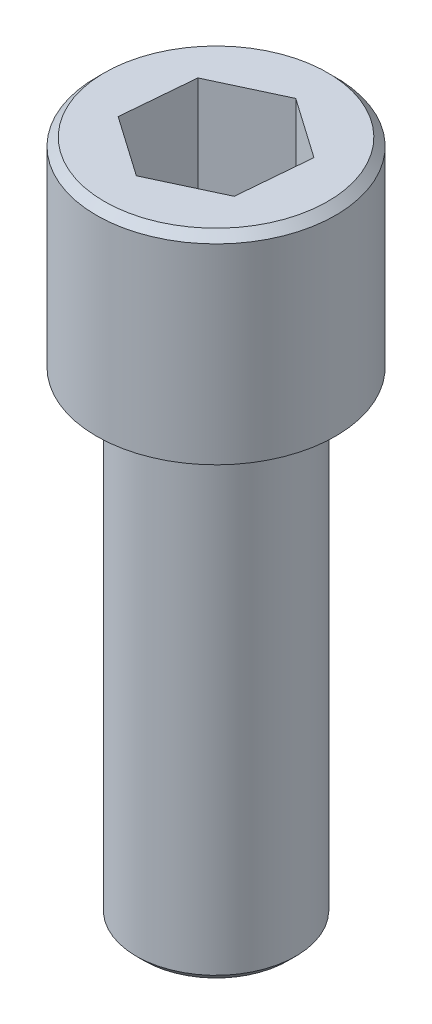
ISO-10303-21;
HEADER;
FILE_DESCRIPTION(('STEP AP214'),'2;1');
FILE_NAME('part.step','',(''),(''),'','','');
FILE_SCHEMA(('AUTOMOTIVE_DESIGN { 1 0 10303 214 1 1 1 1 }'));
ENDSEC;
DATA;
#1=APPLICATION_CONTEXT('core data for automotive mechanical design processes');
#2=APPLICATION_PROTOCOL_DEFINITION('international standard','automotive_design',2000,#1);
#3=PRODUCT_CONTEXT('',#1,'mechanical');
#4=PRODUCT('Part','Part','',(#3));
#5=PRODUCT_RELATED_PRODUCT_CATEGORY('part','',(#4));
#6=PRODUCT_DEFINITION_FORMATION('','',#4);
#7=PRODUCT_DEFINITION_CONTEXT('part definition',#1,'design');
#8=PRODUCT_DEFINITION('design','',#6,#7);
#9=PRODUCT_DEFINITION_SHAPE('','',#8);
#10=(LENGTH_UNIT() NAMED_UNIT(*) SI_UNIT(.MILLI.,.METRE.));
#11=(NAMED_UNIT(*) PLANE_ANGLE_UNIT() SI_UNIT($,.RADIAN.));
#12=(NAMED_UNIT(*) SI_UNIT($,.STERADIAN.) SOLID_ANGLE_UNIT());
#13=UNCERTAINTY_MEASURE_WITH_UNIT(LENGTH_MEASURE(1.E-05),#10,'distance_accuracy_value','');
#14=(GEOMETRIC_REPRESENTATION_CONTEXT(3) GLOBAL_UNCERTAINTY_ASSIGNED_CONTEXT((#13)) GLOBAL_UNIT_ASSIGNED_CONTEXT((#10,
#11,#12)) REPRESENTATION_CONTEXT('',''));
#15=CARTESIAN_POINT('',(0.,0.,0.));
#16=DIRECTION('',(0.,0.,1.));
#17=DIRECTION('',(1.,0.,0.));
#18=AXIS2_PLACEMENT_3D('',#15,#16,#17);
#19=CARTESIAN_POINT('',(0.,15.,0.));
#20=DIRECTION('',(0.,-1.,0.));
#21=DIRECTION('',(0.,0.,-1.));
#22=AXIS2_PLACEMENT_3D('',#19,#20,#21);
#23=CYLINDRICAL_SURFACE('',#22,2.5);
#24=CARTESIAN_POINT('',(0.,0.25,0.));
#25=DIRECTION('',(0.,1.,0.));
#26=DIRECTION('',(0.,0.,1.));
#27=AXIS2_PLACEMENT_3D('',#24,#25,#26);
#28=CIRCLE('',#27,2.5);
#29=CARTESIAN_POINT('',(0.,0.25,2.5));
#30=VERTEX_POINT('',#29);
#31=EDGE_CURVE('E146',#30,#30,#28,.T.);
#32=ORIENTED_EDGE('',*,*,#31,.T.);
#33=EDGE_LOOP('',(#32));
#34=FACE_BOUND('',#33,.T.);
#35=CARTESIAN_POINT('',(0.,15.,0.));
#36=DIRECTION('',(0.,1.,0.));
#37=DIRECTION('',(0.,0.,1.));
#38=AXIS2_PLACEMENT_3D('',#35,#36,#37);
#39=CIRCLE('',#38,2.5);
#40=CARTESIAN_POINT('',(0.,15.,2.5));
#41=VERTEX_POINT('',#40);
#42=EDGE_CURVE('E143',#41,#41,#39,.T.);
#43=ORIENTED_EDGE('',*,*,#42,.F.);
#44=EDGE_LOOP('',(#43));
#45=FACE_BOUND('',#44,.T.);
#46=ADVANCED_FACE('F33',(#34,#45),#23,.T.);
#47=CARTESIAN_POINT('',(0.,0.,0.));
#48=DIRECTION('',(0.,1.,0.));
#49=DIRECTION('',(0.,0.,1.));
#50=AXIS2_PLACEMENT_3D('',#47,#48,#49);
#51=PLANE('',#50);
#52=CARTESIAN_POINT('',(0.,0.,0.));
#53=DIRECTION('',(0.,1.,0.));
#54=DIRECTION('',(0.,0.,1.));
#55=AXIS2_PLACEMENT_3D('',#52,#53,#54);
#56=CIRCLE('',#55,2.25);
#57=CARTESIAN_POINT('',(0.,0.,2.25));
#58=VERTEX_POINT('',#57);
#59=EDGE_CURVE('E149',#58,#58,#56,.F.);
#60=ORIENTED_EDGE('',*,*,#59,.T.);
#61=EDGE_LOOP('',(#60));
#62=FACE_BOUND('',#61,.T.);
#63=ADVANCED_FACE('F166',(#62),#51,.F.);
#64=CARTESIAN_POINT('',(0.,21.25,0.));
#65=DIRECTION('',(0.,-1.,0.));
#66=DIRECTION('',(0.,0.,-1.));
#67=AXIS2_PLACEMENT_3D('',#64,#65,#66);
#68=CYLINDRICAL_SURFACE('',#67,3.75);
#69=CARTESIAN_POINT('',(0.,21.,0.));
#70=DIRECTION('',(0.,1.,0.));
#71=DIRECTION('',(0.,0.,1.));
#72=AXIS2_PLACEMENT_3D('',#69,#70,#71);
#73=CIRCLE('',#72,3.75);
#74=CARTESIAN_POINT('',(0.,21.,3.75));
#75=VERTEX_POINT('',#74);
#76=EDGE_CURVE('E11',#75,#75,#73,.F.);
#77=ORIENTED_EDGE('',*,*,#76,.T.);
#78=EDGE_LOOP('',(#77));
#79=FACE_BOUND('',#78,.T.);
#80=CARTESIAN_POINT('',(0.,15.,0.));
#81=DIRECTION('',(0.,1.,0.));
#82=DIRECTION('',(0.,0.,1.));
#83=AXIS2_PLACEMENT_3D('',#80,#81,#82);
#84=CIRCLE('',#83,3.75);
#85=CARTESIAN_POINT('',(0.,15.,3.75));
#86=VERTEX_POINT('',#85);
#87=EDGE_CURVE('E135',#86,#86,#84,.T.);
#88=ORIENTED_EDGE('',*,*,#87,.T.);
#89=EDGE_LOOP('',(#88));
#90=FACE_BOUND('',#89,.T.);
#91=ADVANCED_FACE('F172',(#79,#90),#68,.T.);
#92=CARTESIAN_POINT('',(0.,21.25,0.));
#93=DIRECTION('',(0.,1.,0.));
#94=DIRECTION('',(0.,0.,1.));
#95=AXIS2_PLACEMENT_3D('',#92,#93,#94);
#96=PLANE('',#95);
#97=CARTESIAN_POINT('',(0.,21.25,0.));
#98=DIRECTION('',(0.,1.,0.));
#99=DIRECTION('',(0.,0.,1.));
#100=AXIS2_PLACEMENT_3D('',#97,#98,#99);
#101=CIRCLE('',#100,3.5);
#102=CARTESIAN_POINT('',(0.,21.25,3.5));
#103=VERTEX_POINT('',#102);
#104=EDGE_CURVE('E41',#103,#103,#101,.T.);
#105=ORIENTED_EDGE('',*,*,#104,.T.);
#106=EDGE_LOOP('',(#105));
#107=FACE_BOUND('',#106,.T.);
#108=DIRECTION('',(0.819694119605471,0.,0.572801492913742));
#109=VECTOR('',#108,1.);
#110=CARTESIAN_POINT('',(-2.09210422704223,21.25,0.977974046959006));
#111=LINE('',#110,#109);
#112=CARTESIAN_POINT('',(-2.09210422704223,21.25,0.977974046959006));
#113=VERTEX_POINT('',#112);
#114=CARTESIAN_POINT('',(-0.199101744612739,21.25,2.30080243146288));
#115=VERTEX_POINT('',#114);
#116=EDGE_CURVE('E48',#113,#115,#111,.T.);
#117=ORIENTED_EDGE('',*,*,#116,.F.);
#118=DIRECTION('',(-0.0862135843862166,0.,0.996276677367929));
#119=VECTOR('',#118,1.);
#120=CARTESIAN_POINT('',(-1.89300248242949,21.25,-1.32282838450387));
#121=LINE('',#120,#119);
#122=CARTESIAN_POINT('',(-1.89300248242949,21.25,-1.32282838450387));
#123=VERTEX_POINT('',#122);
#124=EDGE_CURVE('E131',#123,#113,#121,.T.);
#125=ORIENTED_EDGE('',*,*,#124,.F.);
#126=DIRECTION('',(-0.905907703991688,0.,0.423475184454187));
#127=VECTOR('',#126,1.);
#128=CARTESIAN_POINT('',(0.199101744612738,21.25,-2.30080243146288));
#129=LINE('',#128,#127);
#130=CARTESIAN_POINT('',(0.199101744612738,21.25,-2.30080243146288));
#131=VERTEX_POINT('',#130);
#132=EDGE_CURVE('E129',#131,#123,#129,.T.);
#133=ORIENTED_EDGE('',*,*,#132,.F.);
#134=DIRECTION('',(-0.819694119605471,0.,-0.572801492913742));
#135=VECTOR('',#134,1.);
#136=CARTESIAN_POINT('',(2.09210422704223,21.25,-0.977974046959006));
#137=LINE('',#136,#135);
#138=CARTESIAN_POINT('',(2.09210422704223,21.25,-0.977974046959006));
#139=VERTEX_POINT('',#138);
#140=EDGE_CURVE('E96',#139,#131,#137,.T.);
#141=ORIENTED_EDGE('',*,*,#140,.F.);
#142=DIRECTION('',(0.0862135843862168,0.,-0.996276677367929));
#143=VECTOR('',#142,1.);
#144=CARTESIAN_POINT('',(1.89300248242949,21.25,1.32282838450388));
#145=LINE('',#144,#143);
#146=CARTESIAN_POINT('',(1.89300248242949,21.25,1.32282838450388));
#147=VERTEX_POINT('',#146);
#148=EDGE_CURVE('E125',#147,#139,#145,.T.);
#149=ORIENTED_EDGE('',*,*,#148,.F.);
#150=DIRECTION('',(0.905907703991688,0.,-0.423475184454187));
#151=VECTOR('',#150,1.);
#152=CARTESIAN_POINT('',(-0.19910174461274,21.25,2.30080243146288));
#153=LINE('',#152,#151);
#154=EDGE_CURVE('E122',#115,#147,#153,.T.);
#155=ORIENTED_EDGE('',*,*,#154,.F.);
#156=EDGE_LOOP('',(#117,#125,#133,#141,#149,#155));
#157=FACE_BOUND('',#156,.T.);
#158=ADVANCED_FACE('F154',(#107,#157),#96,.T.);
#159=CARTESIAN_POINT('',(0.,15.,0.));
#160=DIRECTION('',(0.,1.,0.));
#161=DIRECTION('',(0.,0.,1.));
#162=AXIS2_PLACEMENT_3D('',#159,#160,#161);
#163=PLANE('',#162);
#164=ORIENTED_EDGE('',*,*,#42,.T.);
#165=EDGE_LOOP('',(#164));
#166=FACE_BOUND('',#165,.T.);
#167=ORIENTED_EDGE('',*,*,#87,.F.);
#168=EDGE_LOOP('',(#167));
#169=FACE_BOUND('',#168,.T.);
#170=ADVANCED_FACE('F180',(#166,#169),#163,.F.);
#171=CARTESIAN_POINT('',(-2.09210422704223,17.5,0.977974046959006));
#172=DIRECTION('',(-0.572801492913742,0.,0.819694119605471));
#173=DIRECTION('',(0.819694119605471,0.,0.572801492913742));
#174=AXIS2_PLACEMENT_3D('',#171,#172,#173);
#175=PLANE('',#174);
#176=ORIENTED_EDGE('',*,*,#116,.T.);
#177=DIRECTION('',(0.,1.,0.));
#178=VECTOR('',#177,1.);
#179=CARTESIAN_POINT('',(-0.19910174461274,17.5,2.30080243146288));
#180=LINE('',#179,#178);
#181=CARTESIAN_POINT('',(-0.19910174461274,17.5,2.30080243146288));
#182=VERTEX_POINT('',#181);
#183=EDGE_CURVE('E78',#182,#115,#180,.T.);
#184=ORIENTED_EDGE('',*,*,#183,.F.);
#185=DIRECTION('',(0.819694119605471,0.,0.572801492913742));
#186=VECTOR('',#185,1.);
#187=CARTESIAN_POINT('',(-2.09210422704223,17.5,0.977974046959006));
#188=LINE('',#187,#186);
#189=CARTESIAN_POINT('',(-2.09210422704223,17.5,0.977974046959006));
#190=VERTEX_POINT('',#189);
#191=EDGE_CURVE('E133',#190,#182,#188,.T.);
#192=ORIENTED_EDGE('',*,*,#191,.F.);
#193=DIRECTION('',(0.,1.,0.));
#194=VECTOR('',#193,1.);
#195=CARTESIAN_POINT('',(-2.09210422704223,17.5,0.977974046959006));
#196=LINE('',#195,#194);
#197=EDGE_CURVE('E56',#190,#113,#196,.T.);
#198=ORIENTED_EDGE('',*,*,#197,.T.);
#199=EDGE_LOOP('',(#176,#184,#192,#198));
#200=FACE_BOUND('',#199,.T.);
#201=ADVANCED_FACE('F183',(#200),#175,.F.);
#202=CARTESIAN_POINT('',(-1.89300248242949,17.5,-1.32282838450387));
#203=DIRECTION('',(-0.996276677367929,0.,-0.0862135843862166));
#204=DIRECTION('',(-0.0862135843862166,0.,0.996276677367929));
#205=AXIS2_PLACEMENT_3D('',#202,#203,#204);
#206=PLANE('',#205);
#207=ORIENTED_EDGE('',*,*,#124,.T.);
#208=ORIENTED_EDGE('',*,*,#197,.F.);
#209=DIRECTION('',(-0.0862135843862166,0.,0.996276677367929));
#210=VECTOR('',#209,1.);
#211=CARTESIAN_POINT('',(-1.89300248242949,17.5,-1.32282838450387));
#212=LINE('',#211,#210);
#213=CARTESIAN_POINT('',(-1.89300248242949,17.5,-1.32282838450387));
#214=VERTEX_POINT('',#213);
#215=EDGE_CURVE('E108',#214,#190,#212,.T.);
#216=ORIENTED_EDGE('',*,*,#215,.F.);
#217=DIRECTION('',(0.,1.,0.));
#218=VECTOR('',#217,1.);
#219=CARTESIAN_POINT('',(-1.89300248242949,17.5,-1.32282838450387));
#220=LINE('',#219,#218);
#221=EDGE_CURVE('E100',#214,#123,#220,.T.);
#222=ORIENTED_EDGE('',*,*,#221,.T.);
#223=EDGE_LOOP('',(#207,#208,#216,#222));
#224=FACE_BOUND('',#223,.T.);
#225=ADVANCED_FACE('F189',(#224),#206,.F.);
#226=CARTESIAN_POINT('',(0.199101744612738,17.5,-2.30080243146288));
#227=DIRECTION('',(-0.423475184454187,0.,-0.905907703991688));
#228=DIRECTION('',(-0.905907703991688,0.,0.423475184454187));
#229=AXIS2_PLACEMENT_3D('',#226,#227,#228);
#230=PLANE('',#229);
#231=ORIENTED_EDGE('',*,*,#132,.T.);
#232=ORIENTED_EDGE('',*,*,#221,.F.);
#233=DIRECTION('',(-0.905907703991688,0.,0.423475184454187));
#234=VECTOR('',#233,1.);
#235=CARTESIAN_POINT('',(0.199101744612738,17.5,-2.30080243146288));
#236=LINE('',#235,#234);
#237=CARTESIAN_POINT('',(0.199101744612738,17.5,-2.30080243146288));
#238=VERTEX_POINT('',#237);
#239=EDGE_CURVE('E104',#238,#214,#236,.T.);
#240=ORIENTED_EDGE('',*,*,#239,.F.);
#241=DIRECTION('',(0.,1.,0.));
#242=VECTOR('',#241,1.);
#243=CARTESIAN_POINT('',(0.199101744612738,17.5,-2.30080243146288));
#244=LINE('',#243,#242);
#245=EDGE_CURVE('E89',#238,#131,#244,.T.);
#246=ORIENTED_EDGE('',*,*,#245,.T.);
#247=EDGE_LOOP('',(#231,#232,#240,#246));
#248=FACE_BOUND('',#247,.T.);
#249=ADVANCED_FACE('F105',(#248),#230,.F.);
#250=CARTESIAN_POINT('',(2.09210422704223,17.5,-0.977974046959006));
#251=DIRECTION('',(0.572801492913742,0.,-0.819694119605471));
#252=DIRECTION('',(-0.819694119605471,0.,-0.572801492913742));
#253=AXIS2_PLACEMENT_3D('',#250,#251,#252);
#254=PLANE('',#253);
#255=ORIENTED_EDGE('',*,*,#140,.T.);
#256=ORIENTED_EDGE('',*,*,#245,.F.);
#257=DIRECTION('',(-0.819694119605471,0.,-0.572801492913742));
#258=VECTOR('',#257,1.);
#259=CARTESIAN_POINT('',(2.09210422704223,17.5,-0.977974046959006));
#260=LINE('',#259,#258);
#261=CARTESIAN_POINT('',(2.09210422704223,17.5,-0.977974046959006));
#262=VERTEX_POINT('',#261);
#263=EDGE_CURVE('E93',#262,#238,#260,.T.);
#264=ORIENTED_EDGE('',*,*,#263,.F.);
#265=DIRECTION('',(0.,1.,0.));
#266=VECTOR('',#265,1.);
#267=CARTESIAN_POINT('',(2.09210422704223,17.5,-0.977974046959006));
#268=LINE('',#267,#266);
#269=EDGE_CURVE('E101',#262,#139,#268,.T.);
#270=ORIENTED_EDGE('',*,*,#269,.T.);
#271=EDGE_LOOP('',(#255,#256,#264,#270));
#272=FACE_BOUND('',#271,.T.);
#273=ADVANCED_FACE('F91',(#272),#254,.F.);
#274=CARTESIAN_POINT('',(1.89300248242949,17.5,1.32282838450388));
#275=DIRECTION('',(0.996276677367929,0.,0.0862135843862169));
#276=DIRECTION('',(0.0862135843862169,0.,-0.996276677367929));
#277=AXIS2_PLACEMENT_3D('',#274,#275,#276);
#278=PLANE('',#277);
#279=ORIENTED_EDGE('',*,*,#148,.T.);
#280=ORIENTED_EDGE('',*,*,#269,.F.);
#281=DIRECTION('',(0.0862135843862168,0.,-0.996276677367929));
#282=VECTOR('',#281,1.);
#283=CARTESIAN_POINT('',(1.89300248242949,17.5,1.32282838450388));
#284=LINE('',#283,#282);
#285=CARTESIAN_POINT('',(1.89300248242949,17.5,1.32282838450388));
#286=VERTEX_POINT('',#285);
#287=EDGE_CURVE('E114',#286,#262,#284,.T.);
#288=ORIENTED_EDGE('',*,*,#287,.F.);
#289=DIRECTION('',(0.,1.,0.));
#290=VECTOR('',#289,1.);
#291=CARTESIAN_POINT('',(1.89300248242949,17.5,1.32282838450388));
#292=LINE('',#291,#290);
#293=EDGE_CURVE('E138',#286,#147,#292,.T.);
#294=ORIENTED_EDGE('',*,*,#293,.T.);
#295=EDGE_LOOP('',(#279,#280,#288,#294));
#296=FACE_BOUND('',#295,.T.);
#297=ADVANCED_FACE('F193',(#296),#278,.F.);
#298=CARTESIAN_POINT('',(-0.19910174461274,17.5,2.30080243146288));
#299=DIRECTION('',(0.423475184454187,0.,0.905907703991688));
#300=DIRECTION('',(0.905907703991688,0.,-0.423475184454187));
#301=AXIS2_PLACEMENT_3D('',#298,#299,#300);
#302=PLANE('',#301);
#303=ORIENTED_EDGE('',*,*,#154,.T.);
#304=ORIENTED_EDGE('',*,*,#293,.F.);
#305=DIRECTION('',(0.905907703991688,0.,-0.423475184454187));
#306=VECTOR('',#305,1.);
#307=CARTESIAN_POINT('',(-0.19910174461274,17.5,2.30080243146288));
#308=LINE('',#307,#306);
#309=EDGE_CURVE('E116',#182,#286,#308,.T.);
#310=ORIENTED_EDGE('',*,*,#309,.F.);
#311=ORIENTED_EDGE('',*,*,#183,.T.);
#312=EDGE_LOOP('',(#303,#304,#310,#311));
#313=FACE_BOUND('',#312,.T.);
#314=ADVANCED_FACE('F190',(#313),#302,.F.);
#315=CARTESIAN_POINT('',(0.,17.5,0.));
#316=DIRECTION('',(0.,1.,0.));
#317=DIRECTION('',(0.,0.,1.));
#318=AXIS2_PLACEMENT_3D('',#315,#316,#317);
#319=PLANE('',#318);
#320=ORIENTED_EDGE('',*,*,#191,.T.);
#321=ORIENTED_EDGE('',*,*,#309,.T.);
#322=ORIENTED_EDGE('',*,*,#287,.T.);
#323=ORIENTED_EDGE('',*,*,#263,.T.);
#324=ORIENTED_EDGE('',*,*,#239,.T.);
#325=ORIENTED_EDGE('',*,*,#215,.T.);
#326=EDGE_LOOP('',(#320,#321,#322,#323,#324,#325));
#327=FACE_BOUND('',#326,.T.);
#328=ADVANCED_FACE('F111',(#327),#319,.T.);
#329=CARTESIAN_POINT('',(0.,0.25,0.));
#330=DIRECTION('',(0.,1.,0.));
#331=DIRECTION('',(0.,0.,1.));
#332=AXIS2_PLACEMENT_3D('',#329,#330,#331);
#333=CONICAL_SURFACE('',#332,2.5,0.785398163397454);
#334=ORIENTED_EDGE('',*,*,#59,.F.);
#335=EDGE_LOOP('',(#334));
#336=FACE_BOUND('',#335,.T.);
#337=ORIENTED_EDGE('',*,*,#31,.F.);
#338=EDGE_LOOP('',(#337));
#339=FACE_BOUND('',#338,.T.);
#340=ADVANCED_FACE('F158',(#336,#339),#333,.T.);
#341=CARTESIAN_POINT('',(0.,21.25,0.));
#342=DIRECTION('',(0.,-1.,0.));
#343=DIRECTION('',(0.,0.,-1.));
#344=AXIS2_PLACEMENT_3D('',#341,#342,#343);
#345=CONICAL_SURFACE('',#344,3.5,0.785398163397442);
#346=ORIENTED_EDGE('',*,*,#76,.F.);
#347=EDGE_LOOP('',(#346));
#348=FACE_BOUND('',#347,.T.);
#349=ORIENTED_EDGE('',*,*,#104,.F.);
#350=EDGE_LOOP('',(#349));
#351=FACE_BOUND('',#350,.T.);
#352=ADVANCED_FACE('F35',(#348,#351),#345,.T.);
#353=CLOSED_SHELL('',(#46,#63,#91,#158,#170,#201,#225,#249,#273,#297,#314,#328,#340,#352));
#354=MANIFOLD_SOLID_BREP('B2',#353);
#355=ADVANCED_BREP_SHAPE_REPRESENTATION('',(#18,#354),#14);
#356=SHAPE_DEFINITION_REPRESENTATION(#9,#355);
ENDSEC;
END-ISO-10303-21;
